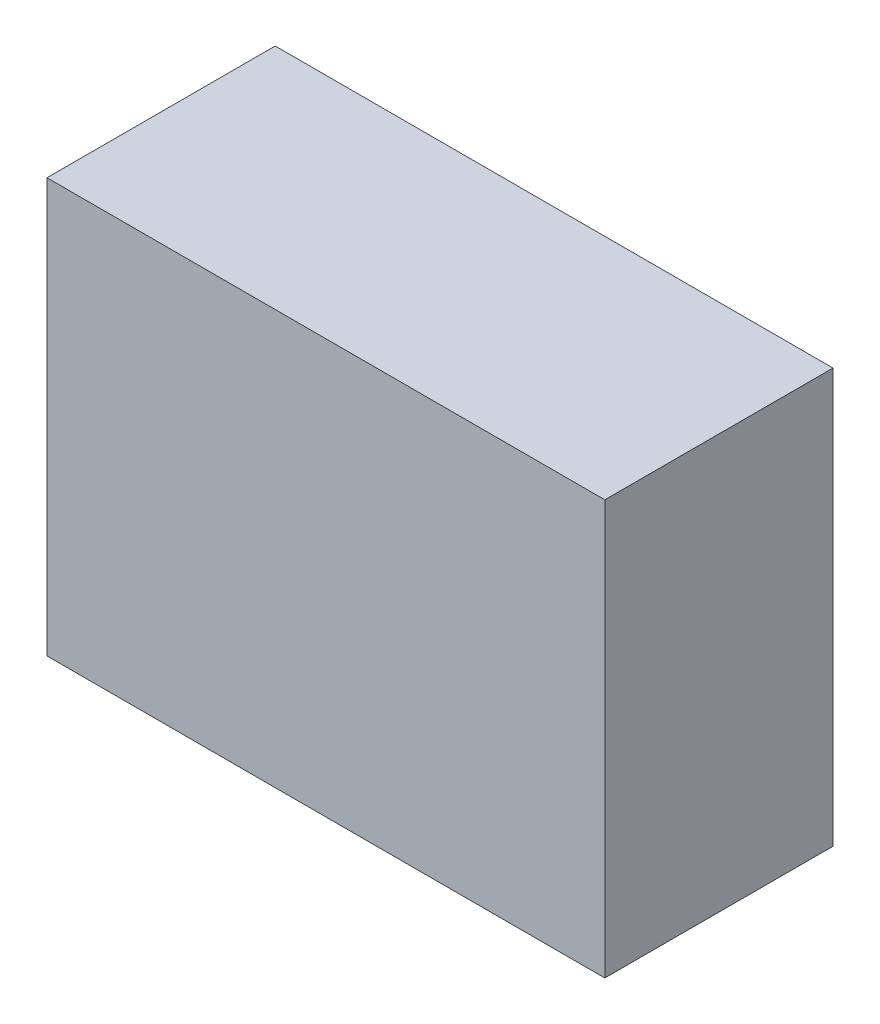
ISO-10303-21;
HEADER;
FILE_DESCRIPTION(('STEP AP214'),'2;1');
FILE_NAME('part.step','',(''),(''),'','','');
FILE_SCHEMA(('AUTOMOTIVE_DESIGN { 1 0 10303 214 1 1 1 1 }'));
ENDSEC;
DATA;
#1=APPLICATION_CONTEXT('core data for automotive mechanical design processes');
#2=APPLICATION_PROTOCOL_DEFINITION('international standard','automotive_design',2000,#1);
#3=PRODUCT_CONTEXT('',#1,'mechanical');
#4=PRODUCT('Part','Part','',(#3));
#5=PRODUCT_RELATED_PRODUCT_CATEGORY('part','',(#4));
#6=PRODUCT_DEFINITION_FORMATION('','',#4);
#7=PRODUCT_DEFINITION_CONTEXT('part definition',#1,'design');
#8=PRODUCT_DEFINITION('design','',#6,#7);
#9=PRODUCT_DEFINITION_SHAPE('','',#8);
#10=(LENGTH_UNIT() NAMED_UNIT(*) SI_UNIT(.MILLI.,.METRE.));
#11=(NAMED_UNIT(*) PLANE_ANGLE_UNIT() SI_UNIT($,.RADIAN.));
#12=(NAMED_UNIT(*) SI_UNIT($,.STERADIAN.) SOLID_ANGLE_UNIT());
#13=UNCERTAINTY_MEASURE_WITH_UNIT(LENGTH_MEASURE(1.E-05),#10,'distance_accuracy_value','');
#14=(GEOMETRIC_REPRESENTATION_CONTEXT(3) GLOBAL_UNCERTAINTY_ASSIGNED_CONTEXT((#13)) GLOBAL_UNIT_ASSIGNED_CONTEXT((#10,
#11,#12)) REPRESENTATION_CONTEXT('',''));
#15=CARTESIAN_POINT('',(0.,0.,0.));
#16=DIRECTION('',(0.,0.,1.));
#17=DIRECTION('',(1.,0.,0.));
#18=AXIS2_PLACEMENT_3D('',#15,#16,#17);
#19=CARTESIAN_POINT('',(33.,-24.5,27.));
#20=DIRECTION('',(-1.,0.,0.));
#21=DIRECTION('',(0.,0.,1.));
#22=AXIS2_PLACEMENT_3D('',#19,#20,#21);
#23=PLANE('',#22);
#24=DIRECTION('',(0.,1.,0.));
#25=VECTOR('',#24,1.);
#26=CARTESIAN_POINT('',(33.,-24.5,0.));
#27=LINE('',#26,#25);
#28=CARTESIAN_POINT('',(33.,-24.5,0.));
#29=VERTEX_POINT('',#28);
#30=CARTESIAN_POINT('',(33.,24.5,0.));
#31=VERTEX_POINT('',#30);
#32=EDGE_CURVE('E113',#29,#31,#27,.T.);
#33=ORIENTED_EDGE('',*,*,#32,.T.);
#34=DIRECTION('',(0.,0.,-1.));
#35=VECTOR('',#34,1.);
#36=CARTESIAN_POINT('',(33.,24.5,27.));
#37=LINE('',#36,#35);
#38=CARTESIAN_POINT('',(33.,24.5,27.));
#39=VERTEX_POINT('',#38);
#40=EDGE_CURVE('E11',#39,#31,#37,.T.);
#41=ORIENTED_EDGE('',*,*,#40,.F.);
#42=DIRECTION('',(0.,1.,0.));
#43=VECTOR('',#42,1.);
#44=CARTESIAN_POINT('',(33.,-24.5,27.));
#45=LINE('',#44,#43);
#46=CARTESIAN_POINT('',(33.,-24.5,27.));
#47=VERTEX_POINT('',#46);
#48=EDGE_CURVE('E95',#47,#39,#45,.T.);
#49=ORIENTED_EDGE('',*,*,#48,.F.);
#50=DIRECTION('',(0.,0.,-1.));
#51=VECTOR('',#50,1.);
#52=CARTESIAN_POINT('',(33.,-24.5,27.));
#53=LINE('',#52,#51);
#54=EDGE_CURVE('E109',#47,#29,#53,.T.);
#55=ORIENTED_EDGE('',*,*,#54,.T.);
#56=EDGE_LOOP('',(#33,#41,#49,#55));
#57=FACE_BOUND('',#56,.T.);
#58=ADVANCED_FACE('F43',(#57),#23,.F.);
#59=CARTESIAN_POINT('',(-33.,24.5,27.));
#60=DIRECTION('',(0.,-1.,0.));
#61=DIRECTION('',(0.,0.,-1.));
#62=AXIS2_PLACEMENT_3D('',#59,#60,#61);
#63=PLANE('',#62);
#64=DIRECTION('',(-1.,0.,0.));
#65=VECTOR('',#64,1.);
#66=CARTESIAN_POINT('',(-33.,24.5,0.));
#67=LINE('',#66,#65);
#68=CARTESIAN_POINT('',(-33.,24.5,0.));
#69=VERTEX_POINT('',#68);
#70=EDGE_CURVE('E100',#31,#69,#67,.T.);
#71=ORIENTED_EDGE('',*,*,#70,.T.);
#72=DIRECTION('',(0.,0.,-1.));
#73=VECTOR('',#72,1.);
#74=CARTESIAN_POINT('',(-33.,24.5,27.));
#75=LINE('',#74,#73);
#76=CARTESIAN_POINT('',(-33.,24.5,27.));
#77=VERTEX_POINT('',#76);
#78=EDGE_CURVE('E52',#77,#69,#75,.T.);
#79=ORIENTED_EDGE('',*,*,#78,.F.);
#80=DIRECTION('',(-1.,0.,0.));
#81=VECTOR('',#80,1.);
#82=CARTESIAN_POINT('',(-33.,24.5,27.));
#83=LINE('',#82,#81);
#84=EDGE_CURVE('E90',#39,#77,#83,.T.);
#85=ORIENTED_EDGE('',*,*,#84,.F.);
#86=ORIENTED_EDGE('',*,*,#40,.T.);
#87=EDGE_LOOP('',(#71,#79,#85,#86));
#88=FACE_BOUND('',#87,.T.);
#89=ADVANCED_FACE('F99',(#88),#63,.F.);
#90=CARTESIAN_POINT('',(-33.,-24.5,27.));
#91=DIRECTION('',(1.,0.,0.));
#92=DIRECTION('',(0.,0.,-1.));
#93=AXIS2_PLACEMENT_3D('',#90,#91,#92);
#94=PLANE('',#93);
#95=DIRECTION('',(0.,-1.,0.));
#96=VECTOR('',#95,1.);
#97=CARTESIAN_POINT('',(-33.,-24.5,0.));
#98=LINE('',#97,#96);
#99=CARTESIAN_POINT('',(-33.,-24.5,0.));
#100=VERTEX_POINT('',#99);
#101=EDGE_CURVE('E77',#69,#100,#98,.T.);
#102=ORIENTED_EDGE('',*,*,#101,.T.);
#103=DIRECTION('',(0.,0.,-1.));
#104=VECTOR('',#103,1.);
#105=CARTESIAN_POINT('',(-33.,-24.5,27.));
#106=LINE('',#105,#104);
#107=CARTESIAN_POINT('',(-33.,-24.5,27.));
#108=VERTEX_POINT('',#107);
#109=EDGE_CURVE('E102',#108,#100,#106,.T.);
#110=ORIENTED_EDGE('',*,*,#109,.F.);
#111=DIRECTION('',(0.,-1.,0.));
#112=VECTOR('',#111,1.);
#113=CARTESIAN_POINT('',(-33.,-24.5,27.));
#114=LINE('',#113,#112);
#115=EDGE_CURVE('E93',#77,#108,#114,.T.);
#116=ORIENTED_EDGE('',*,*,#115,.F.);
#117=ORIENTED_EDGE('',*,*,#78,.T.);
#118=EDGE_LOOP('',(#102,#110,#116,#117));
#119=FACE_BOUND('',#118,.T.);
#120=ADVANCED_FACE('F103',(#119),#94,.F.);
#121=CARTESIAN_POINT('',(-33.,-24.5,27.));
#122=DIRECTION('',(0.,1.,0.));
#123=DIRECTION('',(0.,0.,1.));
#124=AXIS2_PLACEMENT_3D('',#121,#122,#123);
#125=PLANE('',#124);
#126=DIRECTION('',(1.,0.,0.));
#127=VECTOR('',#126,1.);
#128=CARTESIAN_POINT('',(-33.,-24.5,0.));
#129=LINE('',#128,#127);
#130=EDGE_CURVE('E83',#100,#29,#129,.T.);
#131=ORIENTED_EDGE('',*,*,#130,.T.);
#132=ORIENTED_EDGE('',*,*,#54,.F.);
#133=DIRECTION('',(1.,0.,0.));
#134=VECTOR('',#133,1.);
#135=CARTESIAN_POINT('',(-33.,-24.5,27.));
#136=LINE('',#135,#134);
#137=EDGE_CURVE('E60',#108,#47,#136,.T.);
#138=ORIENTED_EDGE('',*,*,#137,.F.);
#139=ORIENTED_EDGE('',*,*,#109,.T.);
#140=EDGE_LOOP('',(#131,#132,#138,#139));
#141=FACE_BOUND('',#140,.T.);
#142=ADVANCED_FACE('F124',(#141),#125,.F.);
#143=CARTESIAN_POINT('',(0.,0.,27.));
#144=DIRECTION('',(0.,0.,-1.));
#145=DIRECTION('',(-1.,0.,0.));
#146=AXIS2_PLACEMENT_3D('',#143,#144,#145);
#147=PLANE('',#146);
#148=ORIENTED_EDGE('',*,*,#48,.T.);
#149=ORIENTED_EDGE('',*,*,#84,.T.);
#150=ORIENTED_EDGE('',*,*,#115,.T.);
#151=ORIENTED_EDGE('',*,*,#137,.T.);
#152=EDGE_LOOP('',(#148,#149,#150,#151));
#153=FACE_BOUND('',#152,.T.);
#154=ADVANCED_FACE('F91',(#153),#147,.F.);
#155=CARTESIAN_POINT('',(0.,0.,0.));
#156=DIRECTION('',(0.,0.,-1.));
#157=DIRECTION('',(-1.,0.,0.));
#158=AXIS2_PLACEMENT_3D('',#155,#156,#157);
#159=PLANE('',#158);
#160=ORIENTED_EDGE('',*,*,#32,.F.);
#161=ORIENTED_EDGE('',*,*,#130,.F.);
#162=ORIENTED_EDGE('',*,*,#101,.F.);
#163=ORIENTED_EDGE('',*,*,#70,.F.);
#164=EDGE_LOOP('',(#160,#161,#162,#163));
#165=FACE_BOUND('',#164,.T.);
#166=ADVANCED_FACE('F127',(#165),#159,.T.);
#167=CLOSED_SHELL('',(#58,#89,#120,#142,#154,#166));
#168=MANIFOLD_SOLID_BREP('B2',#167);
#169=ADVANCED_BREP_SHAPE_REPRESENTATION('',(#18,#168),#14);
#170=SHAPE_DEFINITION_REPRESENTATION(#9,#169);
ENDSEC;
END-ISO-10303-21;
